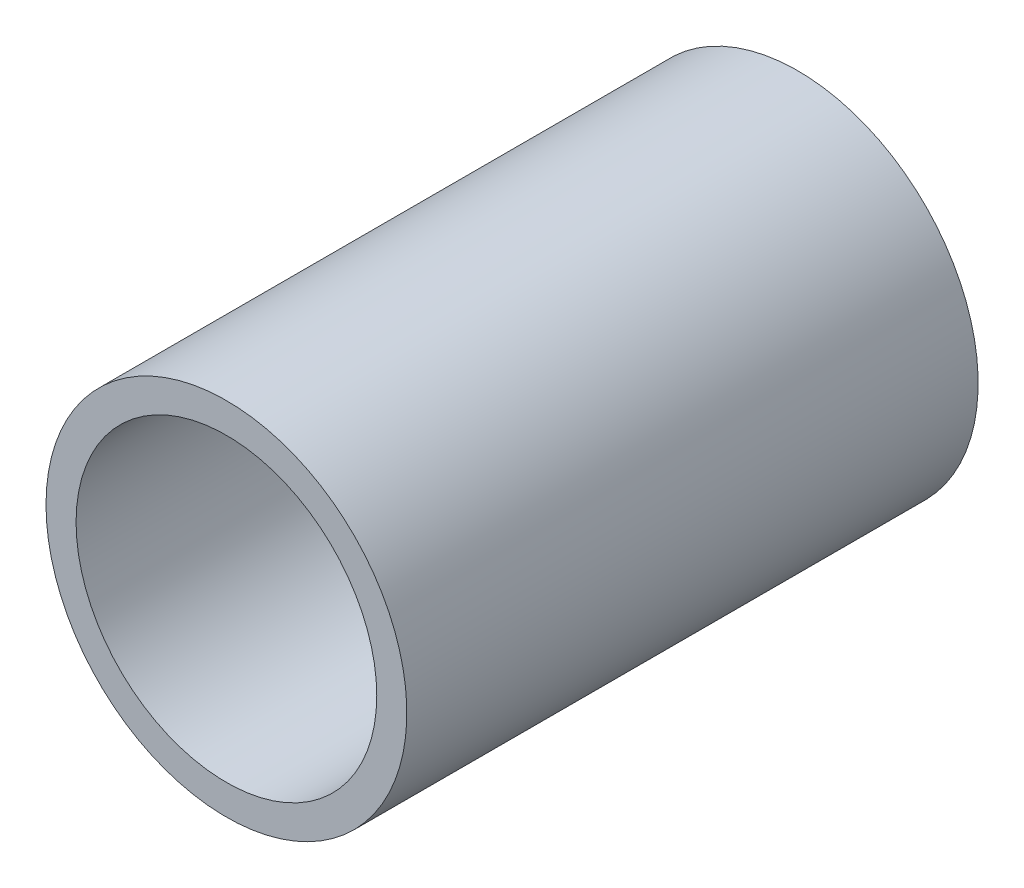
ISO-10303-21;
HEADER;
FILE_DESCRIPTION(('STEP AP214'),'2;1');
FILE_NAME('part.step','',(''),(''),'','','');
FILE_SCHEMA(('AUTOMOTIVE_DESIGN { 1 0 10303 214 1 1 1 1 }'));
ENDSEC;
DATA;
#1=APPLICATION_CONTEXT('core data for automotive mechanical design processes');
#2=APPLICATION_PROTOCOL_DEFINITION('international standard','automotive_design',2000,#1);
#3=PRODUCT_CONTEXT('',#1,'mechanical');
#4=PRODUCT('Part','Part','',(#3));
#5=PRODUCT_RELATED_PRODUCT_CATEGORY('part','',(#4));
#6=PRODUCT_DEFINITION_FORMATION('','',#4);
#7=PRODUCT_DEFINITION_CONTEXT('part definition',#1,'design');
#8=PRODUCT_DEFINITION('design','',#6,#7);
#9=PRODUCT_DEFINITION_SHAPE('','',#8);
#10=(LENGTH_UNIT() NAMED_UNIT(*) SI_UNIT(.MILLI.,.METRE.));
#11=(NAMED_UNIT(*) PLANE_ANGLE_UNIT() SI_UNIT($,.RADIAN.));
#12=(NAMED_UNIT(*) SI_UNIT($,.STERADIAN.) SOLID_ANGLE_UNIT());
#13=UNCERTAINTY_MEASURE_WITH_UNIT(LENGTH_MEASURE(1.E-05),#10,'distance_accuracy_value','');
#14=(GEOMETRIC_REPRESENTATION_CONTEXT(3) GLOBAL_UNCERTAINTY_ASSIGNED_CONTEXT((#13)) GLOBAL_UNIT_ASSIGNED_CONTEXT((#10,
#11,#12)) REPRESENTATION_CONTEXT('',''));
#15=CARTESIAN_POINT('',(0.,0.,0.));
#16=DIRECTION('',(0.,0.,1.));
#17=DIRECTION('',(1.,0.,0.));
#18=AXIS2_PLACEMENT_3D('',#15,#16,#17);
#19=CARTESIAN_POINT('',(0.,0.,30.1625));
#20=DIRECTION('',(0.,0.,1.));
#21=DIRECTION('',(1.,0.,0.));
#22=AXIS2_PLACEMENT_3D('',#19,#20,#21);
#23=PLANE('',#22);
#24=CARTESIAN_POINT('',(0.,0.,30.1625));
#25=DIRECTION('',(0.,0.,1.));
#26=DIRECTION('',(1.,0.,0.));
#27=AXIS2_PLACEMENT_3D('',#24,#25,#26);
#28=CIRCLE('',#27,9.525);
#29=CARTESIAN_POINT('',(-9.525,0.,30.1625));
#30=VERTEX_POINT('',#29);
#31=EDGE_CURVE('E10',#30,#30,#28,.T.);
#32=ORIENTED_EDGE('',*,*,#31,.T.);
#33=EDGE_LOOP('',(#32));
#34=FACE_BOUND('',#33,.T.);
#35=CARTESIAN_POINT('',(0.,0.,30.1625));
#36=DIRECTION('',(0.,0.,1.));
#37=DIRECTION('',(1.,0.,0.));
#38=AXIS2_PLACEMENT_3D('',#35,#36,#37);
#39=CIRCLE('',#38,7.9375);
#40=CARTESIAN_POINT('',(-7.9375,0.,30.1625));
#41=VERTEX_POINT('',#40);
#42=EDGE_CURVE('E42',#41,#41,#39,.T.);
#43=ORIENTED_EDGE('',*,*,#42,.F.);
#44=EDGE_LOOP('',(#43));
#45=FACE_BOUND('',#44,.T.);
#46=ADVANCED_FACE('F31',(#34,#45),#23,.T.);
#47=CARTESIAN_POINT('',(0.,0.,0.));
#48=DIRECTION('',(0.,0.,1.));
#49=DIRECTION('',(1.,0.,0.));
#50=AXIS2_PLACEMENT_3D('',#47,#48,#49);
#51=PLANE('',#50);
#52=CARTESIAN_POINT('',(0.,0.,0.));
#53=DIRECTION('',(0.,0.,1.));
#54=DIRECTION('',(1.,0.,0.));
#55=AXIS2_PLACEMENT_3D('',#52,#53,#54);
#56=CIRCLE('',#55,9.525);
#57=CARTESIAN_POINT('',(-9.525,0.,0.));
#58=VERTEX_POINT('',#57);
#59=EDGE_CURVE('E35',#58,#58,#56,.T.);
#60=ORIENTED_EDGE('',*,*,#59,.F.);
#61=EDGE_LOOP('',(#60));
#62=FACE_BOUND('',#61,.T.);
#63=CARTESIAN_POINT('',(0.,0.,0.));
#64=DIRECTION('',(0.,0.,1.));
#65=DIRECTION('',(1.,0.,0.));
#66=AXIS2_PLACEMENT_3D('',#63,#64,#65);
#67=CIRCLE('',#66,7.9375);
#68=CARTESIAN_POINT('',(-7.9375,0.,0.));
#69=VERTEX_POINT('',#68);
#70=EDGE_CURVE('E44',#69,#69,#67,.T.);
#71=ORIENTED_EDGE('',*,*,#70,.T.);
#72=EDGE_LOOP('',(#71));
#73=FACE_BOUND('',#72,.T.);
#74=ADVANCED_FACE('F54',(#62,#73),#51,.F.);
#75=CARTESIAN_POINT('',(0.,0.,30.1625));
#76=DIRECTION('',(0.,0.,-1.));
#77=DIRECTION('',(-1.,0.,0.));
#78=AXIS2_PLACEMENT_3D('',#75,#76,#77);
#79=CYLINDRICAL_SURFACE('',#78,9.525);
#80=CARTESIAN_POINT('',(-9.525,0.,30.1625));
#81=CARTESIAN_POINT('',(-9.525,0.,29.8483072916667));
#82=CARTESIAN_POINT('',(-9.525,0.,29.5341145833333));
#83=CARTESIAN_POINT('',(-9.525,0.,28.9057291666667));
#84=CARTESIAN_POINT('',(-9.525,0.,28.5915364583333));
#85=CARTESIAN_POINT('',(-9.525,0.,27.9631510416667));
#86=CARTESIAN_POINT('',(-9.525,0.,27.6489583333333));
#87=CARTESIAN_POINT('',(-9.525,0.,27.0205729166667));
#88=CARTESIAN_POINT('',(-9.525,0.,26.7063802083333));
#89=CARTESIAN_POINT('',(-9.525,0.,26.0779947916667));
#90=CARTESIAN_POINT('',(-9.525,0.,25.7638020833333));
#91=CARTESIAN_POINT('',(-9.525,0.,25.1354166666667));
#92=CARTESIAN_POINT('',(-9.525,0.,24.8212239583333));
#93=CARTESIAN_POINT('',(-9.525,0.,24.1928385416667));
#94=CARTESIAN_POINT('',(-9.525,0.,23.8786458333333));
#95=CARTESIAN_POINT('',(-9.525,0.,23.2502604166667));
#96=CARTESIAN_POINT('',(-9.525,0.,22.9360677083333));
#97=CARTESIAN_POINT('',(-9.525,0.,22.3076822916667));
#98=CARTESIAN_POINT('',(-9.525,0.,21.9934895833333));
#99=CARTESIAN_POINT('',(-9.525,0.,21.3651041666667));
#100=CARTESIAN_POINT('',(-9.525,0.,21.0509114583333));
#101=CARTESIAN_POINT('',(-9.525,0.,20.4225260416667));
#102=CARTESIAN_POINT('',(-9.525,0.,20.1083333333333));
#103=CARTESIAN_POINT('',(-9.525,0.,19.4799479166667));
#104=CARTESIAN_POINT('',(-9.525,0.,19.1657552083333));
#105=CARTESIAN_POINT('',(-9.525,0.,18.5373697916667));
#106=CARTESIAN_POINT('',(-9.525,0.,18.2231770833333));
#107=CARTESIAN_POINT('',(-9.525,0.,17.5947916666667));
#108=CARTESIAN_POINT('',(-9.525,0.,17.2805989583333));
#109=CARTESIAN_POINT('',(-9.525,0.,16.6522135416667));
#110=CARTESIAN_POINT('',(-9.525,0.,16.3380208333333));
#111=CARTESIAN_POINT('',(-9.525,0.,15.7096354166667));
#112=CARTESIAN_POINT('',(-9.525,0.,15.3954427083333));
#113=CARTESIAN_POINT('',(-9.525,0.,14.7670572916667));
#114=CARTESIAN_POINT('',(-9.525,0.,14.4528645833333));
#115=CARTESIAN_POINT('',(-9.525,0.,13.8244791666667));
#116=CARTESIAN_POINT('',(-9.525,0.,13.5102864583333));
#117=CARTESIAN_POINT('',(-9.525,0.,12.8819010416667));
#118=CARTESIAN_POINT('',(-9.525,0.,12.5677083333333));
#119=CARTESIAN_POINT('',(-9.525,0.,11.9393229166667));
#120=CARTESIAN_POINT('',(-9.525,0.,11.6251302083333));
#121=CARTESIAN_POINT('',(-9.525,0.,10.9967447916667));
#122=CARTESIAN_POINT('',(-9.525,0.,10.6825520833333));
#123=CARTESIAN_POINT('',(-9.525,0.,10.0541666666667));
#124=CARTESIAN_POINT('',(-9.525,0.,9.73997395833333));
#125=CARTESIAN_POINT('',(-9.525,0.,9.11158854166667));
#126=CARTESIAN_POINT('',(-9.525,0.,8.79739583333333));
#127=CARTESIAN_POINT('',(-9.525,0.,8.16901041666667));
#128=CARTESIAN_POINT('',(-9.525,0.,7.85481770833333));
#129=CARTESIAN_POINT('',(-9.525,0.,7.22643229166667));
#130=CARTESIAN_POINT('',(-9.525,0.,6.91223958333333));
#131=CARTESIAN_POINT('',(-9.525,0.,6.28385416666667));
#132=CARTESIAN_POINT('',(-9.525,0.,5.96966145833333));
#133=CARTESIAN_POINT('',(-9.525,0.,5.34127604166667));
#134=CARTESIAN_POINT('',(-9.525,0.,5.02708333333333));
#135=CARTESIAN_POINT('',(-9.525,0.,4.39869791666667));
#136=CARTESIAN_POINT('',(-9.525,0.,4.08450520833333));
#137=CARTESIAN_POINT('',(-9.525,0.,3.45611979166667));
#138=CARTESIAN_POINT('',(-9.525,0.,3.14192708333333));
#139=CARTESIAN_POINT('',(-9.525,0.,2.51354166666667));
#140=CARTESIAN_POINT('',(-9.525,0.,2.19934895833333));
#141=CARTESIAN_POINT('',(-9.525,0.,1.57096354166667));
#142=CARTESIAN_POINT('',(-9.525,0.,1.25677083333333));
#143=CARTESIAN_POINT('',(-9.525,0.,0.628385416666666));
#144=CARTESIAN_POINT('',(-9.525,0.,0.314192708333333));
#145=CARTESIAN_POINT('',(-9.525,0.,0.));
#146=B_SPLINE_CURVE_WITH_KNOTS('',3,(#80,#81,#82,#83,#84,#85,#86,#87,#88,#89,#90,#91,#92,#93,
#94,#95,#96,#97,#98,#99,#100,#101,#102,#103,#104,#105,#106,#107,#108,#109,#110,#111,#112,#113,
#114,#115,#116,#117,#118,#119,#120,#121,#122,#123,#124,#125,#126,#127,#128,#129,#130,#131,#132,
#133,#134,#135,#136,#137,#138,#139,#140,#141,#142,#143,#144,#145),.UNSPECIFIED.,.F.,.F.,(4,2,2,
2,2,2,2,2,2,2,2,2,2,2,2,2,2,2,2,2,2,2,2,2,2,2,2,2,2,2,2,2,4),(0.,0.942578124999999,1.88515625,
2.827734375,3.7703125,4.712890625,5.65546875,6.598046875,7.540625,8.483203125,9.42578124999999,
10.368359375,11.3109375,12.253515625,13.19609375,14.138671875,15.08125,16.023828125,16.96640625,
17.908984375,18.8515625,19.794140625,20.73671875,21.679296875,22.621875,23.564453125,
24.50703125,25.449609375,26.3921875,27.334765625,28.27734375,29.219921875,30.1625),.UNSPECIFIED.);
#147=EDGE_CURVE('BSEAM33',#30,#58,#146,.T.);
#148=ORIENTED_EDGE('',*,*,#31,.F.);
#149=ORIENTED_EDGE('',*,*,#59,.T.);
#150=ORIENTED_EDGE('',*,*,#147,.T.);
#151=ORIENTED_EDGE('',*,*,#147,.F.);
#152=EDGE_LOOP('',(#148,#150,#149,#151));
#153=FACE_BOUND('',#152,.T.);
#154=ADVANCED_FACE('F33',(#153),#79,.T.);
#155=CARTESIAN_POINT('',(0.,0.,30.1625));
#156=DIRECTION('',(0.,0.,-1.));
#157=DIRECTION('',(-1.,0.,0.));
#158=AXIS2_PLACEMENT_3D('',#155,#156,#157);
#159=CYLINDRICAL_SURFACE('',#158,7.9375);
#160=CARTESIAN_POINT('',(-7.9375,0.,30.1625));
#161=CARTESIAN_POINT('',(-7.9375,0.,29.8483072916667));
#162=CARTESIAN_POINT('',(-7.9375,0.,29.5341145833333));
#163=CARTESIAN_POINT('',(-7.9375,0.,28.9057291666667));
#164=CARTESIAN_POINT('',(-7.9375,0.,28.5915364583333));
#165=CARTESIAN_POINT('',(-7.9375,0.,27.9631510416667));
#166=CARTESIAN_POINT('',(-7.9375,0.,27.6489583333333));
#167=CARTESIAN_POINT('',(-7.9375,0.,27.0205729166667));
#168=CARTESIAN_POINT('',(-7.9375,0.,26.7063802083333));
#169=CARTESIAN_POINT('',(-7.9375,0.,26.0779947916667));
#170=CARTESIAN_POINT('',(-7.9375,0.,25.7638020833333));
#171=CARTESIAN_POINT('',(-7.9375,0.,25.1354166666667));
#172=CARTESIAN_POINT('',(-7.9375,0.,24.8212239583333));
#173=CARTESIAN_POINT('',(-7.9375,0.,24.1928385416667));
#174=CARTESIAN_POINT('',(-7.9375,0.,23.8786458333333));
#175=CARTESIAN_POINT('',(-7.9375,0.,23.2502604166667));
#176=CARTESIAN_POINT('',(-7.9375,0.,22.9360677083333));
#177=CARTESIAN_POINT('',(-7.9375,0.,22.3076822916667));
#178=CARTESIAN_POINT('',(-7.9375,0.,21.9934895833333));
#179=CARTESIAN_POINT('',(-7.9375,0.,21.3651041666667));
#180=CARTESIAN_POINT('',(-7.9375,0.,21.0509114583333));
#181=CARTESIAN_POINT('',(-7.9375,0.,20.4225260416667));
#182=CARTESIAN_POINT('',(-7.9375,0.,20.1083333333333));
#183=CARTESIAN_POINT('',(-7.9375,0.,19.4799479166667));
#184=CARTESIAN_POINT('',(-7.9375,0.,19.1657552083333));
#185=CARTESIAN_POINT('',(-7.9375,0.,18.5373697916667));
#186=CARTESIAN_POINT('',(-7.9375,0.,18.2231770833333));
#187=CARTESIAN_POINT('',(-7.9375,0.,17.5947916666667));
#188=CARTESIAN_POINT('',(-7.9375,0.,17.2805989583333));
#189=CARTESIAN_POINT('',(-7.9375,0.,16.6522135416667));
#190=CARTESIAN_POINT('',(-7.9375,0.,16.3380208333333));
#191=CARTESIAN_POINT('',(-7.9375,0.,15.7096354166667));
#192=CARTESIAN_POINT('',(-7.9375,0.,15.3954427083333));
#193=CARTESIAN_POINT('',(-7.9375,0.,14.7670572916667));
#194=CARTESIAN_POINT('',(-7.9375,0.,14.4528645833333));
#195=CARTESIAN_POINT('',(-7.9375,0.,13.8244791666667));
#196=CARTESIAN_POINT('',(-7.9375,0.,13.5102864583333));
#197=CARTESIAN_POINT('',(-7.9375,0.,12.8819010416667));
#198=CARTESIAN_POINT('',(-7.9375,0.,12.5677083333333));
#199=CARTESIAN_POINT('',(-7.9375,0.,11.9393229166667));
#200=CARTESIAN_POINT('',(-7.9375,0.,11.6251302083333));
#201=CARTESIAN_POINT('',(-7.9375,0.,10.9967447916667));
#202=CARTESIAN_POINT('',(-7.9375,0.,10.6825520833333));
#203=CARTESIAN_POINT('',(-7.9375,0.,10.0541666666667));
#204=CARTESIAN_POINT('',(-7.9375,0.,9.73997395833333));
#205=CARTESIAN_POINT('',(-7.9375,0.,9.11158854166667));
#206=CARTESIAN_POINT('',(-7.9375,0.,8.79739583333333));
#207=CARTESIAN_POINT('',(-7.9375,0.,8.16901041666667));
#208=CARTESIAN_POINT('',(-7.9375,0.,7.85481770833333));
#209=CARTESIAN_POINT('',(-7.9375,0.,7.22643229166667));
#210=CARTESIAN_POINT('',(-7.9375,0.,6.91223958333333));
#211=CARTESIAN_POINT('',(-7.9375,0.,6.28385416666667));
#212=CARTESIAN_POINT('',(-7.9375,0.,5.96966145833333));
#213=CARTESIAN_POINT('',(-7.9375,0.,5.34127604166667));
#214=CARTESIAN_POINT('',(-7.9375,0.,5.02708333333333));
#215=CARTESIAN_POINT('',(-7.9375,0.,4.39869791666667));
#216=CARTESIAN_POINT('',(-7.9375,0.,4.08450520833333));
#217=CARTESIAN_POINT('',(-7.9375,0.,3.45611979166667));
#218=CARTESIAN_POINT('',(-7.9375,0.,3.14192708333333));
#219=CARTESIAN_POINT('',(-7.9375,0.,2.51354166666667));
#220=CARTESIAN_POINT('',(-7.9375,0.,2.19934895833333));
#221=CARTESIAN_POINT('',(-7.9375,0.,1.57096354166667));
#222=CARTESIAN_POINT('',(-7.9375,0.,1.25677083333333));
#223=CARTESIAN_POINT('',(-7.9375,0.,0.628385416666666));
#224=CARTESIAN_POINT('',(-7.9375,0.,0.314192708333333));
#225=CARTESIAN_POINT('',(-7.9375,0.,0.));
#226=B_SPLINE_CURVE_WITH_KNOTS('',3,(#160,#161,#162,#163,#164,#165,#166,#167,#168,#169,#170,
#171,#172,#173,#174,#175,#176,#177,#178,#179,#180,#181,#182,#183,#184,#185,#186,#187,#188,#189,
#190,#191,#192,#193,#194,#195,#196,#197,#198,#199,#200,#201,#202,#203,#204,#205,#206,#207,#208,
#209,#210,#211,#212,#213,#214,#215,#216,#217,#218,#219,#220,#221,#222,#223,#224,#225),
.UNSPECIFIED.,.F.,.F.,(4,2,2,2,2,2,2,2,2,2,2,2,2,2,2,2,2,2,2,2,2,2,2,2,2,2,2,2,2,2,2,2,4),(0.,
0.942578125000003,1.88515625,2.827734375,3.7703125,4.712890625,5.65546875,6.598046875,7.540625,
8.483203125,9.42578125,10.368359375,11.3109375,12.253515625,13.19609375,14.138671875,15.08125,
16.023828125,16.96640625,17.908984375,18.8515625,19.794140625,20.73671875,21.679296875,
22.621875,23.564453125,24.50703125,25.449609375,26.3921875,27.334765625,28.27734375,
29.219921875,30.1625),.UNSPECIFIED.);
#227=EDGE_CURVE('BSEAM50',#41,#69,#226,.T.);
#228=ORIENTED_EDGE('',*,*,#42,.T.);
#229=ORIENTED_EDGE('',*,*,#70,.F.);
#230=ORIENTED_EDGE('',*,*,#227,.T.);
#231=ORIENTED_EDGE('',*,*,#227,.F.);
#232=EDGE_LOOP('',(#228,#230,#229,#231));
#233=FACE_BOUND('',#232,.T.);
#234=ADVANCED_FACE('F50',(#233),#159,.F.);
#235=CLOSED_SHELL('',(#46,#74,#154,#234));
#236=MANIFOLD_SOLID_BREP('B2',#235);
#237=ADVANCED_BREP_SHAPE_REPRESENTATION('',(#18,#236),#14);
#238=SHAPE_DEFINITION_REPRESENTATION(#9,#237);
ENDSEC;
END-ISO-10303-21;
